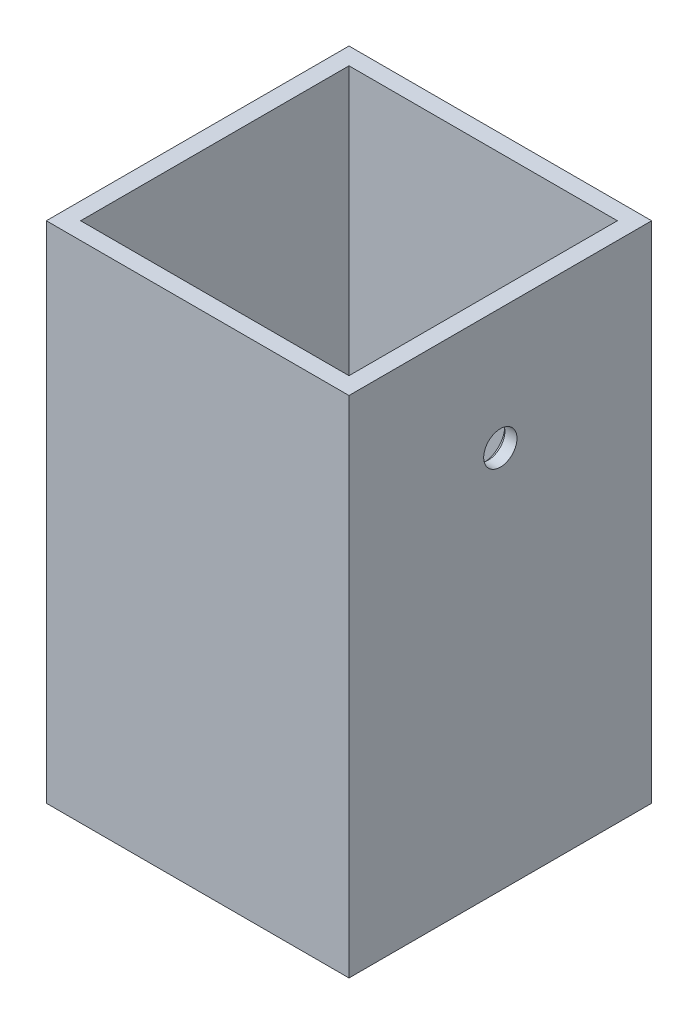
ISO-10303-21;
HEADER;
FILE_DESCRIPTION(('STEP AP214'),'2;1');
FILE_NAME('part.step','',(''),(''),'','','');
FILE_SCHEMA(('AUTOMOTIVE_DESIGN { 1 0 10303 214 1 1 1 1 }'));
ENDSEC;
DATA;
#1=APPLICATION_CONTEXT('core data for automotive mechanical design processes');
#2=APPLICATION_PROTOCOL_DEFINITION('international standard','automotive_design',2000,#1);
#3=PRODUCT_CONTEXT('',#1,'mechanical');
#4=PRODUCT('Part','Part','',(#3));
#5=PRODUCT_RELATED_PRODUCT_CATEGORY('part','',(#4));
#6=PRODUCT_DEFINITION_FORMATION('','',#4);
#7=PRODUCT_DEFINITION_CONTEXT('part definition',#1,'design');
#8=PRODUCT_DEFINITION('design','',#6,#7);
#9=PRODUCT_DEFINITION_SHAPE('','',#8);
#10=(LENGTH_UNIT() NAMED_UNIT(*) SI_UNIT(.MILLI.,.METRE.));
#11=(NAMED_UNIT(*) PLANE_ANGLE_UNIT() SI_UNIT($,.RADIAN.));
#12=(NAMED_UNIT(*) SI_UNIT($,.STERADIAN.) SOLID_ANGLE_UNIT());
#13=UNCERTAINTY_MEASURE_WITH_UNIT(LENGTH_MEASURE(1.E-05),#10,'distance_accuracy_value','');
#14=(GEOMETRIC_REPRESENTATION_CONTEXT(3) GLOBAL_UNCERTAINTY_ASSIGNED_CONTEXT((#13)) GLOBAL_UNIT_ASSIGNED_CONTEXT((#10,
#11,#12)) REPRESENTATION_CONTEXT('',''));
#15=CARTESIAN_POINT('',(0.,0.,0.));
#16=DIRECTION('',(0.,0.,1.));
#17=DIRECTION('',(1.,0.,0.));
#18=AXIS2_PLACEMENT_3D('',#15,#16,#17);
#19=CARTESIAN_POINT('',(0.,50.,0.));
#20=DIRECTION('',(0.,-1.,0.));
#21=DIRECTION('',(0.,0.,-1.));
#22=AXIS2_PLACEMENT_3D('',#19,#20,#21);
#23=PLANE('',#22);
#24=DIRECTION('',(0.,0.,-1.));
#25=VECTOR('',#24,1.);
#26=CARTESIAN_POINT('',(15.,50.,15.));
#27=LINE('',#26,#25);
#28=CARTESIAN_POINT('',(15.,50.,15.));
#29=VERTEX_POINT('',#28);
#30=CARTESIAN_POINT('',(15.,50.,-15.));
#31=VERTEX_POINT('',#30);
#32=EDGE_CURVE('E140',#29,#31,#27,.T.);
#33=ORIENTED_EDGE('',*,*,#32,.T.);
#34=DIRECTION('',(-1.,0.,0.));
#35=VECTOR('',#34,1.);
#36=CARTESIAN_POINT('',(-15.,50.,-15.));
#37=LINE('',#36,#35);
#38=CARTESIAN_POINT('',(-15.,50.,-15.));
#39=VERTEX_POINT('',#38);
#40=EDGE_CURVE('E143',#31,#39,#37,.T.);
#41=ORIENTED_EDGE('',*,*,#40,.T.);
#42=DIRECTION('',(0.,0.,1.));
#43=VECTOR('',#42,1.);
#44=CARTESIAN_POINT('',(-15.,50.,15.));
#45=LINE('',#44,#43);
#46=CARTESIAN_POINT('',(-15.,50.,15.));
#47=VERTEX_POINT('',#46);
#48=EDGE_CURVE('E146',#39,#47,#45,.T.);
#49=ORIENTED_EDGE('',*,*,#48,.T.);
#50=DIRECTION('',(1.,0.,0.));
#51=VECTOR('',#50,1.);
#52=CARTESIAN_POINT('',(-15.,50.,15.));
#53=LINE('',#52,#51);
#54=EDGE_CURVE('E148',#47,#29,#53,.T.);
#55=ORIENTED_EDGE('',*,*,#54,.T.);
#56=EDGE_LOOP('',(#33,#41,#49,#55));
#57=FACE_BOUND('',#56,.T.);
#58=DIRECTION('',(0.,0.,-1.));
#59=VECTOR('',#58,1.);
#60=CARTESIAN_POINT('',(13.3,50.,0.));
#61=LINE('',#60,#59);
#62=CARTESIAN_POINT('',(13.3,50.,13.3));
#63=VERTEX_POINT('',#62);
#64=CARTESIAN_POINT('',(13.3,50.,-13.3));
#65=VERTEX_POINT('',#64);
#66=EDGE_CURVE('E128',#63,#65,#61,.T.);
#67=ORIENTED_EDGE('',*,*,#66,.F.);
#68=DIRECTION('',(1.,0.,0.));
#69=VECTOR('',#68,1.);
#70=CARTESIAN_POINT('',(0.,50.,13.3));
#71=LINE('',#70,#69);
#72=CARTESIAN_POINT('',(-13.3,50.,13.3));
#73=VERTEX_POINT('',#72);
#74=EDGE_CURVE('E112',#73,#63,#71,.T.);
#75=ORIENTED_EDGE('',*,*,#74,.F.);
#76=DIRECTION('',(0.,0.,1.));
#77=VECTOR('',#76,1.);
#78=CARTESIAN_POINT('',(-13.3,50.,0.));
#79=LINE('',#78,#77);
#80=CARTESIAN_POINT('',(-13.3,50.,-13.3));
#81=VERTEX_POINT('',#80);
#82=EDGE_CURVE('E137',#81,#73,#79,.T.);
#83=ORIENTED_EDGE('',*,*,#82,.F.);
#84=DIRECTION('',(-1.,0.,0.));
#85=VECTOR('',#84,1.);
#86=CARTESIAN_POINT('',(0.,50.,-13.3));
#87=LINE('',#86,#85);
#88=EDGE_CURVE('E130',#65,#81,#87,.T.);
#89=ORIENTED_EDGE('',*,*,#88,.F.);
#90=EDGE_LOOP('',(#67,#75,#83,#89));
#91=FACE_BOUND('',#90,.T.);
#92=ADVANCED_FACE('F41',(#57,#91),#23,.F.);
#93=CARTESIAN_POINT('',(0.,0.,0.));
#94=DIRECTION('',(0.,-1.,0.));
#95=DIRECTION('',(0.,0.,-1.));
#96=AXIS2_PLACEMENT_3D('',#93,#94,#95);
#97=PLANE('',#96);
#98=DIRECTION('',(0.,0.,-1.));
#99=VECTOR('',#98,1.);
#100=CARTESIAN_POINT('',(15.,0.,15.));
#101=LINE('',#100,#99);
#102=CARTESIAN_POINT('',(15.,0.,15.));
#103=VERTEX_POINT('',#102);
#104=CARTESIAN_POINT('',(15.,0.,-15.));
#105=VERTEX_POINT('',#104);
#106=EDGE_CURVE('E151',#103,#105,#101,.T.);
#107=ORIENTED_EDGE('',*,*,#106,.F.);
#108=DIRECTION('',(1.,0.,0.));
#109=VECTOR('',#108,1.);
#110=CARTESIAN_POINT('',(-15.,0.,15.));
#111=LINE('',#110,#109);
#112=CARTESIAN_POINT('',(-15.,0.,15.));
#113=VERTEX_POINT('',#112);
#114=EDGE_CURVE('E144',#113,#103,#111,.T.);
#115=ORIENTED_EDGE('',*,*,#114,.F.);
#116=DIRECTION('',(0.,0.,1.));
#117=VECTOR('',#116,1.);
#118=CARTESIAN_POINT('',(-15.,0.,15.));
#119=LINE('',#118,#117);
#120=CARTESIAN_POINT('',(-15.,0.,-15.));
#121=VERTEX_POINT('',#120);
#122=EDGE_CURVE('E156',#121,#113,#119,.T.);
#123=ORIENTED_EDGE('',*,*,#122,.F.);
#124=DIRECTION('',(-1.,0.,0.));
#125=VECTOR('',#124,1.);
#126=CARTESIAN_POINT('',(-15.,0.,-15.));
#127=LINE('',#126,#125);
#128=EDGE_CURVE('E154',#105,#121,#127,.T.);
#129=ORIENTED_EDGE('',*,*,#128,.F.);
#130=EDGE_LOOP('',(#107,#115,#123,#129));
#131=FACE_BOUND('',#130,.T.);
#132=DIRECTION('',(1.,0.,0.));
#133=VECTOR('',#132,1.);
#134=CARTESIAN_POINT('',(0.,0.,13.3));
#135=LINE('',#134,#133);
#136=CARTESIAN_POINT('',(-13.3,0.,13.3));
#137=VERTEX_POINT('',#136);
#138=CARTESIAN_POINT('',(13.3,0.,13.3));
#139=VERTEX_POINT('',#138);
#140=EDGE_CURVE('E110',#137,#139,#135,.T.);
#141=ORIENTED_EDGE('',*,*,#140,.T.);
#142=DIRECTION('',(0.,0.,-1.));
#143=VECTOR('',#142,1.);
#144=CARTESIAN_POINT('',(13.3,0.,0.));
#145=LINE('',#144,#143);
#146=CARTESIAN_POINT('',(13.3,0.,-13.3));
#147=VERTEX_POINT('',#146);
#148=EDGE_CURVE('E118',#139,#147,#145,.T.);
#149=ORIENTED_EDGE('',*,*,#148,.T.);
#150=DIRECTION('',(-1.,0.,0.));
#151=VECTOR('',#150,1.);
#152=CARTESIAN_POINT('',(0.,0.,-13.3));
#153=LINE('',#152,#151);
#154=CARTESIAN_POINT('',(-13.3,0.,-13.3));
#155=VERTEX_POINT('',#154);
#156=EDGE_CURVE('E124',#147,#155,#153,.T.);
#157=ORIENTED_EDGE('',*,*,#156,.T.);
#158=DIRECTION('',(0.,0.,1.));
#159=VECTOR('',#158,1.);
#160=CARTESIAN_POINT('',(-13.3,0.,0.));
#161=LINE('',#160,#159);
#162=EDGE_CURVE('E64',#155,#137,#161,.T.);
#163=ORIENTED_EDGE('',*,*,#162,.T.);
#164=EDGE_LOOP('',(#141,#149,#157,#163));
#165=FACE_BOUND('',#164,.T.);
#166=ADVANCED_FACE('F127',(#131,#165),#97,.T.);
#167=CARTESIAN_POINT('',(15.,50.,15.));
#168=DIRECTION('',(-1.,0.,0.));
#169=DIRECTION('',(0.,0.,1.));
#170=AXIS2_PLACEMENT_3D('',#167,#168,#169);
#171=PLANE('',#170);
#172=CARTESIAN_POINT('',(15.,38.,0.));
#173=DIRECTION('',(1.,0.,0.));
#174=DIRECTION('',(0.,0.,-1.));
#175=AXIS2_PLACEMENT_3D('',#172,#173,#174);
#176=CIRCLE('',#175,1.65);
#177=CARTESIAN_POINT('',(15.,38.,-1.65));
#178=VERTEX_POINT('',#177);
#179=EDGE_CURVE('E229',#178,#178,#176,.T.);
#180=ORIENTED_EDGE('',*,*,#179,.F.);
#181=EDGE_LOOP('',(#180));
#182=FACE_BOUND('',#181,.T.);
#183=ORIENTED_EDGE('',*,*,#106,.T.);
#184=DIRECTION('',(0.,-1.,0.));
#185=VECTOR('',#184,1.);
#186=CARTESIAN_POINT('',(15.,50.,-15.));
#187=LINE('',#186,#185);
#188=EDGE_CURVE('E167',#31,#105,#187,.T.);
#189=ORIENTED_EDGE('',*,*,#188,.F.);
#190=ORIENTED_EDGE('',*,*,#32,.F.);
#191=DIRECTION('',(0.,-1.,0.));
#192=VECTOR('',#191,1.);
#193=CARTESIAN_POINT('',(15.,50.,15.));
#194=LINE('',#193,#192);
#195=EDGE_CURVE('E150',#29,#103,#194,.T.);
#196=ORIENTED_EDGE('',*,*,#195,.T.);
#197=EDGE_LOOP('',(#183,#189,#190,#196));
#198=FACE_BOUND('',#197,.T.);
#199=ADVANCED_FACE('F198',(#182,#198),#171,.F.);
#200=CARTESIAN_POINT('',(-15.,50.,-15.));
#201=DIRECTION('',(0.,0.,1.));
#202=DIRECTION('',(1.,0.,0.));
#203=AXIS2_PLACEMENT_3D('',#200,#201,#202);
#204=PLANE('',#203);
#205=ORIENTED_EDGE('',*,*,#128,.T.);
#206=DIRECTION('',(0.,-1.,0.));
#207=VECTOR('',#206,1.);
#208=CARTESIAN_POINT('',(-15.,50.,-15.));
#209=LINE('',#208,#207);
#210=EDGE_CURVE('E164',#39,#121,#209,.T.);
#211=ORIENTED_EDGE('',*,*,#210,.F.);
#212=ORIENTED_EDGE('',*,*,#40,.F.);
#213=ORIENTED_EDGE('',*,*,#188,.T.);
#214=EDGE_LOOP('',(#205,#211,#212,#213));
#215=FACE_BOUND('',#214,.T.);
#216=ADVANCED_FACE('F211',(#215),#204,.F.);
#217=CARTESIAN_POINT('',(-15.,50.,15.));
#218=DIRECTION('',(1.,0.,0.));
#219=DIRECTION('',(0.,0.,-1.));
#220=AXIS2_PLACEMENT_3D('',#217,#218,#219);
#221=PLANE('',#220);
#222=CARTESIAN_POINT('',(-15.,12.,0.));
#223=DIRECTION('',(-1.,0.,0.));
#224=DIRECTION('',(0.,0.,1.));
#225=AXIS2_PLACEMENT_3D('',#222,#223,#224);
#226=CIRCLE('',#225,1.65);
#227=CARTESIAN_POINT('',(-15.,12.,1.65));
#228=VERTEX_POINT('',#227);
#229=EDGE_CURVE('E125',#228,#228,#226,.T.);
#230=ORIENTED_EDGE('',*,*,#229,.F.);
#231=EDGE_LOOP('',(#230));
#232=FACE_BOUND('',#231,.T.);
#233=ORIENTED_EDGE('',*,*,#122,.T.);
#234=DIRECTION('',(0.,-1.,0.));
#235=VECTOR('',#234,1.);
#236=CARTESIAN_POINT('',(-15.,50.,15.));
#237=LINE('',#236,#235);
#238=EDGE_CURVE('E161',#47,#113,#237,.T.);
#239=ORIENTED_EDGE('',*,*,#238,.F.);
#240=ORIENTED_EDGE('',*,*,#48,.F.);
#241=ORIENTED_EDGE('',*,*,#210,.T.);
#242=EDGE_LOOP('',(#233,#239,#240,#241));
#243=FACE_BOUND('',#242,.T.);
#244=ADVANCED_FACE('F207',(#232,#243),#221,.F.);
#245=CARTESIAN_POINT('',(-15.,50.,15.));
#246=DIRECTION('',(0.,0.,-1.));
#247=DIRECTION('',(-1.,0.,0.));
#248=AXIS2_PLACEMENT_3D('',#245,#246,#247);
#249=PLANE('',#248);
#250=ORIENTED_EDGE('',*,*,#114,.T.);
#251=ORIENTED_EDGE('',*,*,#195,.F.);
#252=ORIENTED_EDGE('',*,*,#54,.F.);
#253=ORIENTED_EDGE('',*,*,#238,.T.);
#254=EDGE_LOOP('',(#250,#251,#252,#253));
#255=FACE_BOUND('',#254,.T.);
#256=ADVANCED_FACE('F205',(#255),#249,.F.);
#257=CARTESIAN_POINT('',(13.3,50.,15.));
#258=DIRECTION('',(-1.,0.,0.));
#259=DIRECTION('',(0.,0.,1.));
#260=AXIS2_PLACEMENT_3D('',#257,#258,#259);
#261=PLANE('',#260);
#262=CARTESIAN_POINT('',(13.3,38.,0.));
#263=DIRECTION('',(-1.,0.,0.));
#264=DIRECTION('',(0.,0.,1.));
#265=AXIS2_PLACEMENT_3D('',#262,#263,#264);
#266=CIRCLE('',#265,2.14999999999999);
#267=CARTESIAN_POINT('',(13.3,38.,2.14999999999999));
#268=VERTEX_POINT('',#267);
#269=EDGE_CURVE('E173',#268,#268,#266,.F.);
#270=ORIENTED_EDGE('',*,*,#269,.T.);
#271=EDGE_LOOP('',(#270));
#272=FACE_BOUND('',#271,.T.);
#273=ORIENTED_EDGE('',*,*,#148,.F.);
#274=DIRECTION('',(0.,-1.,0.));
#275=VECTOR('',#274,1.);
#276=CARTESIAN_POINT('',(13.3,50.,13.3));
#277=LINE('',#276,#275);
#278=EDGE_CURVE('E106',#63,#139,#277,.T.);
#279=ORIENTED_EDGE('',*,*,#278,.F.);
#280=ORIENTED_EDGE('',*,*,#66,.T.);
#281=DIRECTION('',(0.,-1.,0.));
#282=VECTOR('',#281,1.);
#283=CARTESIAN_POINT('',(13.3,50.,-13.3));
#284=LINE('',#283,#282);
#285=EDGE_CURVE('E121',#65,#147,#284,.T.);
#286=ORIENTED_EDGE('',*,*,#285,.T.);
#287=EDGE_LOOP('',(#273,#279,#280,#286));
#288=FACE_BOUND('',#287,.T.);
#289=ADVANCED_FACE('F119',(#272,#288),#261,.T.);
#290=CARTESIAN_POINT('',(-15.,50.,-13.3));
#291=DIRECTION('',(0.,0.,1.));
#292=DIRECTION('',(1.,0.,0.));
#293=AXIS2_PLACEMENT_3D('',#290,#291,#292);
#294=PLANE('',#293);
#295=ORIENTED_EDGE('',*,*,#156,.F.);
#296=ORIENTED_EDGE('',*,*,#285,.F.);
#297=ORIENTED_EDGE('',*,*,#88,.T.);
#298=DIRECTION('',(0.,-1.,0.));
#299=VECTOR('',#298,1.);
#300=CARTESIAN_POINT('',(-13.3,50.,-13.3));
#301=LINE('',#300,#299);
#302=EDGE_CURVE('E246',#81,#155,#301,.T.);
#303=ORIENTED_EDGE('',*,*,#302,.T.);
#304=EDGE_LOOP('',(#295,#296,#297,#303));
#305=FACE_BOUND('',#304,.T.);
#306=ADVANCED_FACE('F252',(#305),#294,.T.);
#307=CARTESIAN_POINT('',(-13.3,50.,15.));
#308=DIRECTION('',(1.,0.,0.));
#309=DIRECTION('',(0.,0.,-1.));
#310=AXIS2_PLACEMENT_3D('',#307,#308,#309);
#311=PLANE('',#310);
#312=CARTESIAN_POINT('',(-13.3,12.,0.));
#313=DIRECTION('',(1.,0.,0.));
#314=DIRECTION('',(0.,0.,-1.));
#315=AXIS2_PLACEMENT_3D('',#312,#313,#314);
#316=CIRCLE('',#315,2.14999999999999);
#317=CARTESIAN_POINT('',(-13.3,12.,-2.14999999999999));
#318=VERTEX_POINT('',#317);
#319=EDGE_CURVE('E11',#318,#318,#316,.F.);
#320=ORIENTED_EDGE('',*,*,#319,.T.);
#321=EDGE_LOOP('',(#320));
#322=FACE_BOUND('',#321,.T.);
#323=ORIENTED_EDGE('',*,*,#162,.F.);
#324=ORIENTED_EDGE('',*,*,#302,.F.);
#325=ORIENTED_EDGE('',*,*,#82,.T.);
#326=DIRECTION('',(0.,-1.,0.));
#327=VECTOR('',#326,1.);
#328=CARTESIAN_POINT('',(-13.3,50.,13.3));
#329=LINE('',#328,#327);
#330=EDGE_CURVE('E57',#73,#137,#329,.T.);
#331=ORIENTED_EDGE('',*,*,#330,.T.);
#332=EDGE_LOOP('',(#323,#324,#325,#331));
#333=FACE_BOUND('',#332,.T.);
#334=ADVANCED_FACE('F248',(#322,#333),#311,.T.);
#335=CARTESIAN_POINT('',(-15.,50.,13.3));
#336=DIRECTION('',(0.,0.,-1.));
#337=DIRECTION('',(-1.,0.,0.));
#338=AXIS2_PLACEMENT_3D('',#335,#336,#337);
#339=PLANE('',#338);
#340=ORIENTED_EDGE('',*,*,#140,.F.);
#341=ORIENTED_EDGE('',*,*,#330,.F.);
#342=ORIENTED_EDGE('',*,*,#74,.T.);
#343=ORIENTED_EDGE('',*,*,#278,.T.);
#344=EDGE_LOOP('',(#340,#341,#342,#343));
#345=FACE_BOUND('',#344,.T.);
#346=ADVANCED_FACE('F108',(#345),#339,.T.);
#347=CARTESIAN_POINT('',(-13.,12.,0.));
#348=DIRECTION('',(-1.,0.,0.));
#349=DIRECTION('',(0.,0.,1.));
#350=AXIS2_PLACEMENT_3D('',#347,#348,#349);
#351=CYLINDRICAL_SURFACE('',#350,1.65);
#352=CARTESIAN_POINT('',(-13.8,12.,0.));
#353=DIRECTION('',(1.,0.,0.));
#354=DIRECTION('',(0.,0.,-1.));
#355=AXIS2_PLACEMENT_3D('',#352,#353,#354);
#356=CIRCLE('',#355,1.65);
#357=CARTESIAN_POINT('',(-13.8,12.,-1.65));
#358=VERTEX_POINT('',#357);
#359=EDGE_CURVE('E50',#358,#358,#356,.T.);
#360=ORIENTED_EDGE('',*,*,#359,.T.);
#361=EDGE_LOOP('',(#360));
#362=FACE_BOUND('',#361,.T.);
#363=ORIENTED_EDGE('',*,*,#229,.T.);
#364=EDGE_LOOP('',(#363));
#365=FACE_BOUND('',#364,.T.);
#366=ADVANCED_FACE('F178',(#362,#365),#351,.F.);
#367=CARTESIAN_POINT('',(13.,38.,0.));
#368=DIRECTION('',(1.,0.,0.));
#369=DIRECTION('',(0.,0.,-1.));
#370=AXIS2_PLACEMENT_3D('',#367,#368,#369);
#371=CYLINDRICAL_SURFACE('',#370,1.65);
#372=CARTESIAN_POINT('',(13.8,38.,0.));
#373=DIRECTION('',(-1.,0.,0.));
#374=DIRECTION('',(0.,0.,1.));
#375=AXIS2_PLACEMENT_3D('',#372,#373,#374);
#376=CIRCLE('',#375,1.65);
#377=CARTESIAN_POINT('',(13.8,38.,1.65));
#378=VERTEX_POINT('',#377);
#379=EDGE_CURVE('E170',#378,#378,#376,.T.);
#380=ORIENTED_EDGE('',*,*,#379,.T.);
#381=EDGE_LOOP('',(#380));
#382=FACE_BOUND('',#381,.T.);
#383=ORIENTED_EDGE('',*,*,#179,.T.);
#384=EDGE_LOOP('',(#383));
#385=FACE_BOUND('',#384,.T.);
#386=ADVANCED_FACE('F188',(#382,#385),#371,.F.);
#387=CARTESIAN_POINT('',(13.8,38.,0.));
#388=DIRECTION('',(-1.,0.,0.));
#389=DIRECTION('',(0.,0.,1.));
#390=AXIS2_PLACEMENT_3D('',#387,#388,#389);
#391=CONICAL_SURFACE('',#390,1.65,0.785398163397442);
#392=ORIENTED_EDGE('',*,*,#269,.F.);
#393=EDGE_LOOP('',(#392));
#394=FACE_BOUND('',#393,.T.);
#395=ORIENTED_EDGE('',*,*,#379,.F.);
#396=EDGE_LOOP('',(#395));
#397=FACE_BOUND('',#396,.T.);
#398=ADVANCED_FACE('F182',(#394,#397),#391,.F.);
#399=CARTESIAN_POINT('',(-13.8,12.,0.));
#400=DIRECTION('',(1.,0.,0.));
#401=DIRECTION('',(0.,0.,-1.));
#402=AXIS2_PLACEMENT_3D('',#399,#400,#401);
#403=CONICAL_SURFACE('',#402,1.65,0.785398163397442);
#404=ORIENTED_EDGE('',*,*,#319,.F.);
#405=EDGE_LOOP('',(#404));
#406=FACE_BOUND('',#405,.T.);
#407=ORIENTED_EDGE('',*,*,#359,.F.);
#408=EDGE_LOOP('',(#407));
#409=FACE_BOUND('',#408,.T.);
#410=ADVANCED_FACE('F44',(#406,#409),#403,.F.);
#411=CLOSED_SHELL('',(#92,#166,#199,#216,#244,#256,#289,#306,#334,#346,#366,#386,#398,#410));
#412=MANIFOLD_SOLID_BREP('B2',#411);
#413=ADVANCED_BREP_SHAPE_REPRESENTATION('',(#18,#412),#14);
#414=SHAPE_DEFINITION_REPRESENTATION(#9,#413);
ENDSEC;
END-ISO-10303-21;
